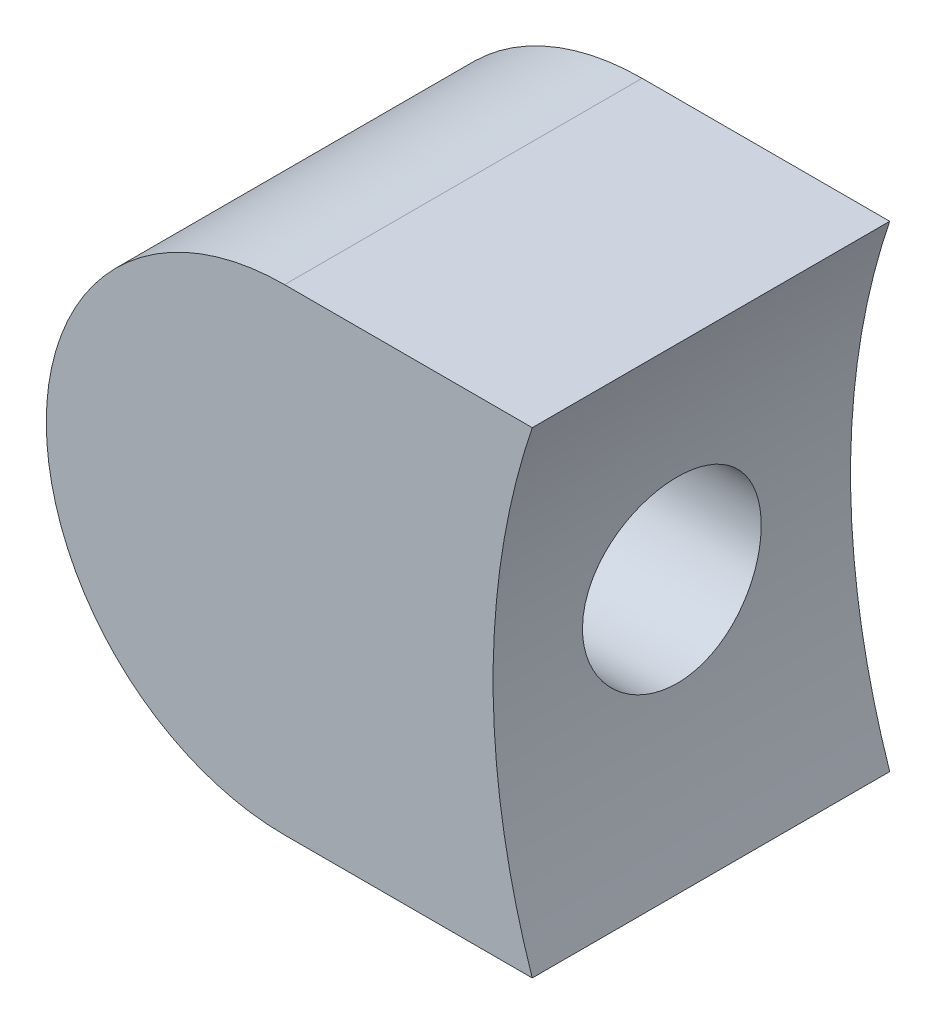
ISO-10303-21;
HEADER;
FILE_DESCRIPTION(('STEP AP214'),'2;1');
FILE_NAME('part.step','',(''),(''),'','','');
FILE_SCHEMA(('AUTOMOTIVE_DESIGN { 1 0 10303 214 1 1 1 1 }'));
ENDSEC;
DATA;
#1=APPLICATION_CONTEXT('core data for automotive mechanical design processes');
#2=APPLICATION_PROTOCOL_DEFINITION('international standard','automotive_design',2000,#1);
#3=PRODUCT_CONTEXT('',#1,'mechanical');
#4=PRODUCT('Part','Part','',(#3));
#5=PRODUCT_RELATED_PRODUCT_CATEGORY('part','',(#4));
#6=PRODUCT_DEFINITION_FORMATION('','',#4);
#7=PRODUCT_DEFINITION_CONTEXT('part definition',#1,'design');
#8=PRODUCT_DEFINITION('design','',#6,#7);
#9=PRODUCT_DEFINITION_SHAPE('','',#8);
#10=(LENGTH_UNIT() NAMED_UNIT(*) SI_UNIT(.MILLI.,.METRE.));
#11=(NAMED_UNIT(*) PLANE_ANGLE_UNIT() SI_UNIT($,.RADIAN.));
#12=(NAMED_UNIT(*) SI_UNIT($,.STERADIAN.) SOLID_ANGLE_UNIT());
#13=UNCERTAINTY_MEASURE_WITH_UNIT(LENGTH_MEASURE(1.E-05),#10,'distance_accuracy_value','');
#14=(GEOMETRIC_REPRESENTATION_CONTEXT(3) GLOBAL_UNCERTAINTY_ASSIGNED_CONTEXT((#13)) GLOBAL_UNIT_ASSIGNED_CONTEXT((#10,
#11,#12)) REPRESENTATION_CONTEXT('',''));
#15=CARTESIAN_POINT('',(0.,0.,0.));
#16=DIRECTION('',(0.,0.,1.));
#17=DIRECTION('',(1.,0.,0.));
#18=AXIS2_PLACEMENT_3D('',#15,#16,#17);
#19=CARTESIAN_POINT('',(0.,0.,6.));
#20=DIRECTION('',(0.,0.,-1.));
#21=DIRECTION('',(-1.,0.,0.));
#22=AXIS2_PLACEMENT_3D('',#19,#20,#21);
#23=CYLINDRICAL_SURFACE('',#22,12.5);
#24=CARTESIAN_POINT('',(-12.5,0.,4.5));
#25=CARTESIAN_POINT('',(-12.499998867873,0.0839320235538497,4.49999641802928));
#26=CARTESIAN_POINT('',(-12.4991457100204,0.167917158665596,4.49293167065366));
#27=CARTESIAN_POINT('',(-12.495824352711,0.333552285654125,4.46485946792231));
#28=CARTESIAN_POINT('',(-12.4933544466864,0.415199714795034,4.44383727937471));
#29=CARTESIAN_POINT('',(-12.4870779632713,0.573737397670264,4.38847686173699));
#30=CARTESIAN_POINT('',(-12.4832722657654,0.650630743796123,4.35414739658791));
#31=CARTESIAN_POINT('',(-12.4747479632173,0.797549578916,4.27316563245835));
#32=CARTESIAN_POINT('',(-12.4700295202071,0.867576283567578,4.22651552012334));
#33=CARTESIAN_POINT('',(-12.460180052721,0.999145657672255,4.12196256901238));
#34=CARTESIAN_POINT('',(-12.4550472515452,1.0606483456536,4.06400957994404));
#35=CARTESIAN_POINT('',(-12.4449619698576,1.17307965519171,3.93860351755605));
#36=CARTESIAN_POINT('',(-12.4400094983534,1.22400774913237,3.87114997049068));
#37=CARTESIAN_POINT('',(-12.4308280185202,1.31399171436948,3.72839958735081));
#38=CARTESIAN_POINT('',(-12.4266012951985,1.35301037836285,3.65307913770993));
#39=CARTESIAN_POINT('',(-12.4193730672343,1.4178302865078,3.49689564894563));
#40=CARTESIAN_POINT('',(-12.4163715196899,1.44363199348388,3.41603280401535));
#41=CARTESIAN_POINT('',(-12.4119503036869,1.481164650227,3.25147357034429));
#42=CARTESIAN_POINT('',(-12.4105230726271,1.49296288993823,3.16779273578616));
#43=CARTESIAN_POINT('',(-12.4093888845306,1.50236187609835,2.99962753181792));
#44=CARTESIAN_POINT('',(-12.4096818635516,1.49996315026424,2.91514319239152));
#45=CARTESIAN_POINT('',(-12.4119480733153,1.48109158039334,2.74823701760783));
#46=CARTESIAN_POINT('',(-12.4139124717338,1.46469271611151,2.66580668065991));
#47=CARTESIAN_POINT('',(-12.4192864043804,1.41840173085033,2.50487648608932));
#48=CARTESIAN_POINT('',(-12.4226959657844,1.38850935612907,2.4263767024105));
#49=CARTESIAN_POINT('',(-12.4305861039738,1.31599990349931,2.27530526588044));
#50=CARTESIAN_POINT('',(-12.4350693931099,1.27335053101962,2.20274926082322));
#51=CARTESIAN_POINT('',(-12.444599699395,1.17656086584735,2.06579639454212));
#52=CARTESIAN_POINT('',(-12.4496467403106,1.12242008861578,2.00139987754871));
#53=CARTESIAN_POINT('',(-12.4597751654319,1.0037737778109,1.88216445781781));
#54=CARTESIAN_POINT('',(-12.464856563712,0.939204450256078,1.82738901507147));
#55=CARTESIAN_POINT('',(-12.4744510399275,0.80175397946936,1.72944423949985));
#56=CARTESIAN_POINT('',(-12.478964116721,0.728872819540023,1.68627492999043));
#57=CARTESIAN_POINT('',(-12.4869159430851,0.576819654131422,1.61276835718017));
#58=CARTESIAN_POINT('',(-12.4903543736405,0.497645789357795,1.58243490333478));
#59=CARTESIAN_POINT('',(-12.4957665326545,0.33527801113672,1.53551063107455));
#60=CARTESIAN_POINT('',(-12.4977403242792,0.252084271220811,1.51891921999776));
#61=CARTESIAN_POINT('',(-12.4999926250152,0.0845871981871086,1.50003187225116));
#62=CARTESIAN_POINT('',(-12.5002815046876,0.000293860216026169,1.49764848379965));
#63=CARTESIAN_POINT('',(-12.4991593911616,-0.16749103412163,1.50701428893413));
#64=CARTESIAN_POINT('',(-12.4977484312654,-0.250982606163664,1.51876320564768));
#65=CARTESIAN_POINT('',(-12.4933916690343,-0.414537131964178,1.55598748200155));
#66=CARTESIAN_POINT('',(-12.4904505118954,-0.494609673184517,1.58142130652504));
#67=CARTESIAN_POINT('',(-12.4833627750896,-0.64935269884323,1.64525035167679));
#68=CARTESIAN_POINT('',(-12.4792161574379,-0.724023012961737,1.68364598074504));
#69=CARTESIAN_POINT('',(-12.4701542579347,-0.866233588832522,1.77252145795122));
#70=CARTESIAN_POINT('',(-12.4652354042322,-0.933738144813755,1.82305806890541));
#71=CARTESIAN_POINT('',(-12.455190895971,-1.05933812576102,1.93470042320409));
#72=CARTESIAN_POINT('',(-12.4500652338742,-1.11743320736475,1.99580655207398));
#73=CARTESIAN_POINT('',(-12.4401529742471,-1.22287397613077,2.12723780771384));
#74=CARTESIAN_POINT('',(-12.4353682915654,-1.27016181615969,2.19760950767193));
#75=CARTESIAN_POINT('',(-12.4267107496692,-1.35224657214666,2.34534751253778));
#76=CARTESIAN_POINT('',(-12.4228378733971,-1.38704372178037,2.42271368655912));
#77=CARTESIAN_POINT('',(-12.4164552867251,-1.44306498334079,2.58205530444735));
#78=CARTESIAN_POINT('',(-12.4139422637816,-1.46432210079673,2.6640190059297));
#79=CARTESIAN_POINT('',(-12.4105542637293,-1.49276636081758,2.83038448474253));
#80=CARTESIAN_POINT('',(-12.4096792168553,-1.49995410263041,2.91478615807866));
#81=CARTESIAN_POINT('',(-12.4096681633035,-1.50004516908965,3.08305636481859));
#82=CARTESIAN_POINT('',(-12.4105210931972,-1.49303936835675,3.16692486288563));
#83=CARTESIAN_POINT('',(-12.4138461473713,-1.46513424336044,3.33228339319708));
#84=CARTESIAN_POINT('',(-12.4163182722328,-1.44423491411034,3.41377342458779));
#85=CARTESIAN_POINT('',(-12.4225998262293,-1.38916369910273,3.57205226944435));
#86=CARTESIAN_POINT('',(-12.4264088508406,-1.35499582785269,3.64884249674774));
#87=CARTESIAN_POINT('',(-12.4349357269569,-1.27436641314005,3.79561387353505));
#88=CARTESIAN_POINT('',(-12.4396535863076,-1.22790476354723,3.86559496422965));
#89=CARTESIAN_POINT('',(-12.4495027561294,-1.12366844823603,3.99722647005442));
#90=CARTESIAN_POINT('',(-12.4546364290673,-1.06582601965075,4.05882305163314));
#91=CARTESIAN_POINT('',(-12.4647177484085,-0.940610466672236,4.171471239783));
#92=CARTESIAN_POINT('',(-12.4696653505255,-0.873235091318004,4.2225203488146));
#93=CARTESIAN_POINT('',(-12.4788360854662,-0.730596612325683,4.31277528899943));
#94=CARTESIAN_POINT('',(-12.4830566108105,-0.655306617312087,4.35193886286114));
#95=CARTESIAN_POINT('',(-12.4902709259863,-0.499211375842655,4.41701188222129));
#96=CARTESIAN_POINT('',(-12.4932660590307,-0.418412282181072,4.44293584809019));
#97=CARTESIAN_POINT('',(-12.4969634163,-0.280988550618348,4.47453171016906));
#98=CARTESIAN_POINT('',(-12.4980966397165,-0.225233284876743,4.48406874194319));
#99=CARTESIAN_POINT('',(-12.4996153102102,-0.112993367846847,4.49680407174548));
#100=CARTESIAN_POINT('',(-12.5000007622246,-0.0565087213768126,4.50000241162523));
#101=CARTESIAN_POINT('',(-12.5,0.,4.5));
#102=B_SPLINE_CURVE_WITH_KNOTS('',3,(#24,#25,#26,#27,#28,#29,#30,#31,#32,#33,#34,#35,#36,#37,
#38,#39,#40,#41,#42,#43,#44,#45,#46,#47,#48,#49,#50,#51,#52,#53,#54,#55,#56,#57,#58,#59,#60,#61,
#62,#63,#64,#65,#66,#67,#68,#69,#70,#71,#72,#73,#74,#75,#76,#77,#78,#79,#80,#81,#82,#83,#84,#85,
#86,#87,#88,#89,#90,#91,#92,#93,#94,#95,#96,#97,#98,#99,#100,#101),.UNSPECIFIED.,.T.,.F.,(4,2,2,
2,2,2,2,2,2,2,2,2,2,2,2,2,2,2,2,2,2,2,2,2,2,2,2,2,2,2,2,2,2,2,2,2,2,2,4),(0.,0.25158967547808,
0.503445347043117,0.7551354318778,1.00678087720846,1.25956936097939,1.51237045452442,
1.76595344748199,2.01952755999557,2.27187819171639,2.5242194433424,2.77523546456126,
3.02625620626698,3.27791786855268,3.52959014434631,3.78286472320158,4.036139810863,
4.28949001347139,4.54282928911309,4.79460761312113,5.04638100450539,5.29739451278874,
5.54841593150834,5.80063460892781,6.05286248801782,6.30641037908358,6.55995352653149,
6.81287624132444,7.06578818330771,7.31708596596146,7.56838383881168,7.81960573856942,
8.07082980715607,8.32359762010159,8.57642521760045,8.83014145119729,9.08357882396374,
9.25296714728133,9.42235435219904),.UNSPECIFIED.);
#103=CARTESIAN_POINT('',(-12.5,0.,4.5));
#104=VERTEX_POINT('',#103);
#105=EDGE_CURVE('E146',#104,#104,#102,.T.);
#106=ORIENTED_EDGE('',*,*,#105,.T.);
#107=EDGE_LOOP('',(#106));
#108=FACE_BOUND('',#107,.T.);
#109=CARTESIAN_POINT('',(0.,0.,0.));
#110=DIRECTION('',(0.,0.,-1.));
#111=DIRECTION('',(1.,0.,0.));
#112=AXIS2_PLACEMENT_3D('',#109,#110,#111);
#113=CIRCLE('',#112,12.5);
#114=CARTESIAN_POINT('',(-11.842719282327,-4.,0.));
#115=VERTEX_POINT('',#114);
#116=CARTESIAN_POINT('',(-11.842719282327,4.,0.));
#117=VERTEX_POINT('',#116);
#118=EDGE_CURVE('E114',#115,#117,#113,.T.);
#119=ORIENTED_EDGE('',*,*,#118,.T.);
#120=DIRECTION('',(0.,0.,-1.));
#121=VECTOR('',#120,1.);
#122=CARTESIAN_POINT('',(-11.842719282327,4.,6.));
#123=LINE('',#122,#121);
#124=CARTESIAN_POINT('',(-11.842719282327,4.,6.));
#125=VERTEX_POINT('',#124);
#126=EDGE_CURVE('E97',#125,#117,#123,.T.);
#127=ORIENTED_EDGE('',*,*,#126,.F.);
#128=CARTESIAN_POINT('',(0.,0.,6.));
#129=DIRECTION('',(0.,0.,-1.));
#130=DIRECTION('',(1.,0.,0.));
#131=AXIS2_PLACEMENT_3D('',#128,#129,#130);
#132=CIRCLE('',#131,12.5);
#133=CARTESIAN_POINT('',(-11.842719282327,-4.,6.));
#134=VERTEX_POINT('',#133);
#135=EDGE_CURVE('E103',#134,#125,#132,.T.);
#136=ORIENTED_EDGE('',*,*,#135,.F.);
#137=DIRECTION('',(0.,0.,-1.));
#138=VECTOR('',#137,1.);
#139=CARTESIAN_POINT('',(-11.842719282327,-4.,6.));
#140=LINE('',#139,#138);
#141=EDGE_CURVE('E117',#134,#115,#140,.T.);
#142=ORIENTED_EDGE('',*,*,#141,.T.);
#143=EDGE_LOOP('',(#119,#127,#136,#142));
#144=FACE_BOUND('',#143,.T.);
#145=ADVANCED_FACE('F39',(#108,#144),#23,.F.);
#146=CARTESIAN_POINT('',(-11.842719282327,4.,6.));
#147=DIRECTION('',(0.,-1.,0.));
#148=DIRECTION('',(0.,0.,-1.));
#149=AXIS2_PLACEMENT_3D('',#146,#147,#148);
#150=PLANE('',#149);
#151=DIRECTION('',(-1.,0.,0.));
#152=VECTOR('',#151,1.);
#153=CARTESIAN_POINT('',(-11.842719282327,4.,0.));
#154=LINE('',#153,#152);
#155=CARTESIAN_POINT('',(-16.,4.,0.));
#156=VERTEX_POINT('',#155);
#157=EDGE_CURVE('E182',#117,#156,#154,.T.);
#158=ORIENTED_EDGE('',*,*,#157,.T.);
#159=DIRECTION('',(0.,0.,-1.));
#160=VECTOR('',#159,1.);
#161=CARTESIAN_POINT('',(-16.,4.,6.));
#162=LINE('',#161,#160);
#163=CARTESIAN_POINT('',(-16.,4.,6.));
#164=VERTEX_POINT('',#163);
#165=EDGE_CURVE('E100',#156,#164,#162,.F.);
#166=ORIENTED_EDGE('',*,*,#165,.T.);
#167=DIRECTION('',(-1.,0.,0.));
#168=VECTOR('',#167,1.);
#169=CARTESIAN_POINT('',(-11.842719282327,4.,6.));
#170=LINE('',#169,#168);
#171=EDGE_CURVE('E92',#125,#164,#170,.T.);
#172=ORIENTED_EDGE('',*,*,#171,.F.);
#173=ORIENTED_EDGE('',*,*,#126,.T.);
#174=EDGE_LOOP('',(#158,#166,#172,#173));
#175=FACE_BOUND('',#174,.T.);
#176=ADVANCED_FACE('F95',(#175),#150,.F.);
#177=CARTESIAN_POINT('',(-20.,-4.,6.));
#178=DIRECTION('',(0.,1.,0.));
#179=DIRECTION('',(0.,0.,1.));
#180=AXIS2_PLACEMENT_3D('',#177,#178,#179);
#181=PLANE('',#180);
#182=DIRECTION('',(1.,0.,0.));
#183=VECTOR('',#182,1.);
#184=CARTESIAN_POINT('',(-20.,-4.,6.));
#185=LINE('',#184,#183);
#186=CARTESIAN_POINT('',(-16.,-4.,6.));
#187=VERTEX_POINT('',#186);
#188=EDGE_CURVE('E102',#187,#134,#185,.T.);
#189=ORIENTED_EDGE('',*,*,#188,.F.);
#190=DIRECTION('',(0.,0.,-1.));
#191=VECTOR('',#190,1.);
#192=CARTESIAN_POINT('',(-16.,-4.,6.));
#193=LINE('',#192,#191);
#194=CARTESIAN_POINT('',(-16.,-4.,0.));
#195=VERTEX_POINT('',#194);
#196=EDGE_CURVE('E11',#187,#195,#193,.T.);
#197=ORIENTED_EDGE('',*,*,#196,.T.);
#198=DIRECTION('',(1.,0.,0.));
#199=VECTOR('',#198,1.);
#200=CARTESIAN_POINT('',(-20.,-4.,0.));
#201=LINE('',#200,#199);
#202=EDGE_CURVE('E111',#195,#115,#201,.T.);
#203=ORIENTED_EDGE('',*,*,#202,.T.);
#204=ORIENTED_EDGE('',*,*,#141,.F.);
#205=EDGE_LOOP('',(#189,#197,#203,#204));
#206=FACE_BOUND('',#205,.T.);
#207=ADVANCED_FACE('F190',(#206),#181,.F.);
#208=CARTESIAN_POINT('',(0.,0.,6.));
#209=DIRECTION('',(0.,0.,1.));
#210=DIRECTION('',(1.,0.,0.));
#211=AXIS2_PLACEMENT_3D('',#208,#209,#210);
#212=PLANE('',#211);
#213=ORIENTED_EDGE('',*,*,#171,.T.);
#214=CARTESIAN_POINT('',(-16.,0.,6.));
#215=DIRECTION('',(0.,0.,1.));
#216=DIRECTION('',(1.,0.,0.));
#217=AXIS2_PLACEMENT_3D('',#214,#215,#216);
#218=CIRCLE('',#217,4.);
#219=CARTESIAN_POINT('',(-20.,0.,6.));
#220=VERTEX_POINT('',#219);
#221=EDGE_CURVE('E50',#164,#220,#218,.T.);
#222=ORIENTED_EDGE('',*,*,#221,.T.);
#223=CARTESIAN_POINT('',(-16.,0.,6.));
#224=DIRECTION('',(0.,0.,1.));
#225=DIRECTION('',(1.,0.,0.));
#226=AXIS2_PLACEMENT_3D('',#223,#224,#225);
#227=CIRCLE('',#226,4.);
#228=EDGE_CURVE('E58',#220,#187,#227,.T.);
#229=ORIENTED_EDGE('',*,*,#228,.T.);
#230=ORIENTED_EDGE('',*,*,#188,.T.);
#231=ORIENTED_EDGE('',*,*,#135,.T.);
#232=EDGE_LOOP('',(#213,#222,#229,#230,#231));
#233=FACE_BOUND('',#232,.T.);
#234=ADVANCED_FACE('F106',(#233),#212,.T.);
#235=CARTESIAN_POINT('',(0.,0.,0.));
#236=DIRECTION('',(0.,0.,1.));
#237=DIRECTION('',(1.,0.,0.));
#238=AXIS2_PLACEMENT_3D('',#235,#236,#237);
#239=PLANE('',#238);
#240=CARTESIAN_POINT('',(-16.,0.,0.));
#241=DIRECTION('',(0.,0.,1.));
#242=DIRECTION('',(1.,0.,0.));
#243=AXIS2_PLACEMENT_3D('',#240,#241,#242);
#244=CIRCLE('',#243,4.);
#245=CARTESIAN_POINT('',(-20.,0.,0.));
#246=VERTEX_POINT('',#245);
#247=EDGE_CURVE('E195',#195,#246,#244,.F.);
#248=ORIENTED_EDGE('',*,*,#247,.T.);
#249=CARTESIAN_POINT('',(-16.,0.,0.));
#250=DIRECTION('',(0.,0.,1.));
#251=DIRECTION('',(1.,0.,0.));
#252=AXIS2_PLACEMENT_3D('',#249,#250,#251);
#253=CIRCLE('',#252,4.);
#254=EDGE_CURVE('E194',#246,#156,#253,.F.);
#255=ORIENTED_EDGE('',*,*,#254,.T.);
#256=ORIENTED_EDGE('',*,*,#157,.F.);
#257=ORIENTED_EDGE('',*,*,#118,.F.);
#258=ORIENTED_EDGE('',*,*,#202,.F.);
#259=EDGE_LOOP('',(#248,#255,#256,#257,#258));
#260=FACE_BOUND('',#259,.T.);
#261=ADVANCED_FACE('F140',(#260),#239,.F.);
#262=CARTESIAN_POINT('',(-10.,0.,3.));
#263=DIRECTION('',(-1.,0.,0.));
#264=DIRECTION('',(0.,0.,1.));
#265=AXIS2_PLACEMENT_3D('',#262,#263,#264);
#266=CYLINDRICAL_SURFACE('',#265,1.5);
#267=CARTESIAN_POINT('',(-20.,0.,1.5));
#268=CARTESIAN_POINT('',(-20.0000033256289,-0.0406944283973191,1.49999877177197));
#269=CARTESIAN_POINT('',(-19.9993782607743,-0.0813680861182127,1.50165712503439));
#270=CARTESIAN_POINT('',(-19.9969069712268,-0.162399201823214,1.50826302501836));
#271=CARTESIAN_POINT('',(-19.9950610770269,-0.202756742392983,1.51320968155921));
#272=CARTESIAN_POINT('',(-19.9877647102678,-0.322653174897333,1.53288546719824));
#273=CARTESIAN_POINT('',(-19.9805549700143,-0.401348400681007,1.55245098462581));
#274=CARTESIAN_POINT('',(-19.9621900045024,-0.554058449818505,1.60374913887558));
#275=CARTESIAN_POINT('',(-19.9510369944509,-0.628075873554347,1.63547494526381));
#276=CARTESIAN_POINT('',(-19.9258928809211,-0.769770959011273,1.71009023032854));
#277=CARTESIAN_POINT('',(-19.9118999676605,-0.837444537591144,1.75298683276697));
#278=CARTESIAN_POINT('',(-19.8818626368544,-0.967346599491284,1.85061205264806));
#279=CARTESIAN_POINT('',(-19.8657603874358,-1.02926958467277,1.90572904267475));
#280=CARTESIAN_POINT('',(-19.8336025717856,-1.14324279320908,2.02540895864939));
#281=CARTESIAN_POINT('',(-19.8175470225959,-1.19528977206722,2.0899749765254));
#282=CARTESIAN_POINT('',(-19.7866244159186,-1.28998298069114,2.22971878513964));
#283=CARTESIAN_POINT('',(-19.7718259434661,-1.33219550604264,2.30520715291591));
#284=CARTESIAN_POINT('',(-19.7459981946454,-1.40318750743587,2.46285138088627));
#285=CARTESIAN_POINT('',(-19.7349672753239,-1.43197284081049,2.54500431540721));
#286=CARTESIAN_POINT('',(-19.7185442072057,-1.47408411229866,2.71011594674405));
#287=CARTESIAN_POINT('',(-19.7129393523968,-1.48799566181386,2.7929034135809));
#288=CARTESIAN_POINT('',(-19.7073806149005,-1.50179556476095,2.95981450775102));
#289=CARTESIAN_POINT('',(-19.707424508727,-1.50168943589491,3.04393759631328));
#290=CARTESIAN_POINT('',(-19.7129751352208,-1.4879042504185,3.20577008106313));
#291=CARTESIAN_POINT('',(-19.7181547625154,-1.47503790683102,3.28356200778895));
#292=CARTESIAN_POINT('',(-19.7328495149351,-1.43744132424502,3.4357882053831));
#293=CARTESIAN_POINT('',(-19.742365231753,-1.41270946608174,3.51022201648687));
#294=CARTESIAN_POINT('',(-19.7648570030481,-1.35163755391211,3.65527694419289));
#295=CARTESIAN_POINT('',(-19.7778951363466,-1.3150866725211,3.72579924658127));
#296=CARTESIAN_POINT('',(-19.8059420521327,-1.2315608289882,3.85994553304031));
#297=CARTESIAN_POINT('',(-19.8209515207572,-1.18458223346155,3.92356710112008));
#298=CARTESIAN_POINT('',(-19.852479297884,-1.07782175128324,4.04659938969123));
#299=CARTESIAN_POINT('',(-19.869031253415,-1.01739205795079,4.10544067477581));
#300=CARTESIAN_POINT('',(-19.9009152212378,-0.887320986512529,4.21233157847093));
#301=CARTESIAN_POINT('',(-19.916246881528,-0.817676965789148,4.26037809049486));
#302=CARTESIAN_POINT('',(-19.9442714882872,-0.66968723986154,4.34495289658393));
#303=CARTESIAN_POINT('',(-19.9569184850499,-0.591220539542261,4.38128541127984));
#304=CARTESIAN_POINT('',(-19.9777960785474,-0.428732848852288,4.44000775973094));
#305=CARTESIAN_POINT('',(-19.9860333225548,-0.344720434087237,4.46241858729892));
#306=CARTESIAN_POINT('',(-19.9943652641226,-0.216558436440288,4.48492299165084));
#307=CARTESIAN_POINT('',(-19.9964719936983,-0.173445649042698,4.49057254696174));
#308=CARTESIAN_POINT('',(-19.9992907488365,-0.0868967349374135,4.49810974589236));
#309=CARTESIAN_POINT('',(-20.0000043474261,-0.0434610285634967,4.50000163245323));
#310=CARTESIAN_POINT('',(-20.,0.,4.5));
#311=B_SPLINE_CURVE_WITH_KNOTS('',3,(#267,#268,#269,#270,#271,#272,#273,#274,#275,#276,#277,
#278,#279,#280,#281,#282,#283,#284,#285,#286,#287,#288,#289,#290,#291,#292,#293,#294,#295,#296,
#297,#298,#299,#300,#301,#302,#303,#304,#305,#306,#307,#308,#309,#310),.UNSPECIFIED.,.F.,.F.,(4,
2,2,2,2,2,2,2,2,2,2,2,2,2,2,2,2,2,2,2,2,4),(0.,0.122004165629939,0.243975316802218,
0.486933389122464,0.729755191418078,0.972732225167151,1.22496219975096,1.47727489479742,
1.7392004007286,2.00101154001053,2.25208513778236,2.50305990712181,2.73901396321912,
2.97500022670228,3.21545253315063,3.45598875358111,3.7126732008052,3.96943142391607,
4.23028180536024,4.49073786512117,4.62117204894323,4.75145887014864),.UNSPECIFIED.);
#312=CARTESIAN_POINT('',(-20.,0.,1.5));
#313=VERTEX_POINT('',#312);
#314=CARTESIAN_POINT('',(-20.,0.,4.5));
#315=VERTEX_POINT('',#314);
#316=EDGE_CURVE('E116',#313,#315,#311,.T.);
#317=ORIENTED_EDGE('',*,*,#316,.T.);
#318=CARTESIAN_POINT('',(-20.,0.,4.5));
#319=CARTESIAN_POINT('',(-20.0000033256289,0.040694428397319,4.50000122822803));
#320=CARTESIAN_POINT('',(-19.9993782607743,0.0813680861182128,4.49834287496561));
#321=CARTESIAN_POINT('',(-19.9969069712268,0.162399201823214,4.49173697498164));
#322=CARTESIAN_POINT('',(-19.9950610770269,0.202756742392983,4.48679031844079));
#323=CARTESIAN_POINT('',(-19.9877647102678,0.322653174897333,4.46711453280176));
#324=CARTESIAN_POINT('',(-19.9805549700143,0.401348400681007,4.44754901537419));
#325=CARTESIAN_POINT('',(-19.9621900045024,0.554058449818504,4.39625086112442));
#326=CARTESIAN_POINT('',(-19.9510369944509,0.628075873554347,4.36452505473619));
#327=CARTESIAN_POINT('',(-19.9258928809211,0.769770959011272,4.28990976967146));
#328=CARTESIAN_POINT('',(-19.9118999676605,0.837444537591144,4.24701316723303));
#329=CARTESIAN_POINT('',(-19.8818626368544,0.967346599491283,4.14938794735194));
#330=CARTESIAN_POINT('',(-19.8657603874358,1.02926958467277,4.09427095732525));
#331=CARTESIAN_POINT('',(-19.8336025717856,1.14324279320908,3.97459104135061));
#332=CARTESIAN_POINT('',(-19.8175470225959,1.19528977206722,3.9100250234746));
#333=CARTESIAN_POINT('',(-19.7866244159186,1.28998298069114,3.77028121486036));
#334=CARTESIAN_POINT('',(-19.7718259434661,1.33219550604264,3.69479284708409));
#335=CARTESIAN_POINT('',(-19.7459981946454,1.40318750743587,3.53714861911373));
#336=CARTESIAN_POINT('',(-19.7349672753239,1.43197284081049,3.45499568459279));
#337=CARTESIAN_POINT('',(-19.7185442072057,1.47408411229866,3.28988405325595));
#338=CARTESIAN_POINT('',(-19.7129393523968,1.48799566181386,3.2070965864191));
#339=CARTESIAN_POINT('',(-19.7073806149005,1.50179556476095,3.04018549224898));
#340=CARTESIAN_POINT('',(-19.707424508727,1.50168943589491,2.95606240368672));
#341=CARTESIAN_POINT('',(-19.7129751352208,1.4879042504185,2.79422991893687));
#342=CARTESIAN_POINT('',(-19.7181547625154,1.47503790683102,2.71643799221105));
#343=CARTESIAN_POINT('',(-19.7328495149351,1.43744132424502,2.5642117946169));
#344=CARTESIAN_POINT('',(-19.742365231753,1.41270946608174,2.48977798351313));
#345=CARTESIAN_POINT('',(-19.7648570030481,1.35163755391211,2.34472305580711));
#346=CARTESIAN_POINT('',(-19.7778951363466,1.3150866725211,2.27420075341873));
#347=CARTESIAN_POINT('',(-19.8059420521327,1.2315608289882,2.14005446695969));
#348=CARTESIAN_POINT('',(-19.8209515207572,1.18458223346155,2.07643289887992));
#349=CARTESIAN_POINT('',(-19.852479297884,1.07782175128324,1.95340061030877));
#350=CARTESIAN_POINT('',(-19.869031253415,1.01739205795079,1.89455932522419));
#351=CARTESIAN_POINT('',(-19.9009152212378,0.88732098651253,1.78766842152907));
#352=CARTESIAN_POINT('',(-19.916246881528,0.817676965789149,1.73962190950514));
#353=CARTESIAN_POINT('',(-19.9442714882872,0.669687239861542,1.65504710341607));
#354=CARTESIAN_POINT('',(-19.9569184850499,0.591220539542263,1.61871458872017));
#355=CARTESIAN_POINT('',(-19.9777960785474,0.42873284885229,1.55999224026906));
#356=CARTESIAN_POINT('',(-19.9860333225548,0.344720434087239,1.53758141270108));
#357=CARTESIAN_POINT('',(-19.9943652641226,0.216558436440289,1.51507700834916));
#358=CARTESIAN_POINT('',(-19.9964719936983,0.173445649042699,1.50942745303826));
#359=CARTESIAN_POINT('',(-19.9992907488365,0.0868967349374139,1.50189025410764));
#360=CARTESIAN_POINT('',(-20.0000043474261,0.0434610285634971,1.49999836754677));
#361=CARTESIAN_POINT('',(-20.,0.,1.5));
#362=B_SPLINE_CURVE_WITH_KNOTS('',3,(#318,#319,#320,#321,#322,#323,#324,#325,#326,#327,#328,
#329,#330,#331,#332,#333,#334,#335,#336,#337,#338,#339,#340,#341,#342,#343,#344,#345,#346,#347,
#348,#349,#350,#351,#352,#353,#354,#355,#356,#357,#358,#359,#360,#361),.UNSPECIFIED.,.F.,.F.,(4,
2,2,2,2,2,2,2,2,2,2,2,2,2,2,2,2,2,2,2,2,4),(0.,0.122004165629939,0.243975316802218,
0.486933389122464,0.729755191418078,0.97273222516715,1.22496219975096,1.47727489479742,
1.7392004007286,2.00101154001053,2.25208513778236,2.50305990712181,2.73901396321912,
2.97500022670228,3.21545253315063,3.45598875358111,3.7126732008052,3.96943142391607,
4.23028180536024,4.49073786512118,4.62117204894323,4.75145887014865),.UNSPECIFIED.);
#363=EDGE_CURVE('E121',#315,#313,#362,.T.);
#364=ORIENTED_EDGE('',*,*,#363,.T.);
#365=EDGE_LOOP('',(#317,#364));
#366=FACE_BOUND('',#365,.T.);
#367=ORIENTED_EDGE('',*,*,#105,.F.);
#368=EDGE_LOOP('',(#367));
#369=FACE_BOUND('',#368,.T.);
#370=ADVANCED_FACE('F136',(#366,#369),#266,.F.);
#371=CARTESIAN_POINT('',(-16.,0.,6.));
#372=DIRECTION('',(0.,0.,-1.));
#373=DIRECTION('',(-1.,0.,0.));
#374=AXIS2_PLACEMENT_3D('',#371,#372,#373);
#375=CYLINDRICAL_SURFACE('',#374,4.);
#376=ORIENTED_EDGE('',*,*,#196,.F.);
#377=ORIENTED_EDGE('',*,*,#228,.F.);
#378=DIRECTION('',(0.,0.,-1.));
#379=VECTOR('',#378,1.);
#380=CARTESIAN_POINT('',(-20.,0.,6.));
#381=LINE('',#380,#379);
#382=EDGE_CURVE('E44',#315,#220,#381,.F.);
#383=ORIENTED_EDGE('',*,*,#382,.F.);
#384=ORIENTED_EDGE('',*,*,#316,.F.);
#385=DIRECTION('',(0.,0.,-1.));
#386=VECTOR('',#385,1.);
#387=CARTESIAN_POINT('',(-20.,0.,6.));
#388=LINE('',#387,#386);
#389=EDGE_CURVE('E175',#246,#313,#388,.F.);
#390=ORIENTED_EDGE('',*,*,#389,.F.);
#391=ORIENTED_EDGE('',*,*,#247,.F.);
#392=EDGE_LOOP('',(#376,#377,#383,#384,#390,#391));
#393=FACE_BOUND('',#392,.T.);
#394=ADVANCED_FACE('F41',(#393),#375,.T.);
#395=CARTESIAN_POINT('',(-16.,0.,6.));
#396=DIRECTION('',(0.,0.,-1.));
#397=DIRECTION('',(-1.,0.,0.));
#398=AXIS2_PLACEMENT_3D('',#395,#396,#397);
#399=CYLINDRICAL_SURFACE('',#398,4.);
#400=ORIENTED_EDGE('',*,*,#221,.F.);
#401=ORIENTED_EDGE('',*,*,#165,.F.);
#402=ORIENTED_EDGE('',*,*,#254,.F.);
#403=ORIENTED_EDGE('',*,*,#389,.T.);
#404=ORIENTED_EDGE('',*,*,#363,.F.);
#405=ORIENTED_EDGE('',*,*,#382,.T.);
#406=EDGE_LOOP('',(#400,#401,#402,#403,#404,#405));
#407=FACE_BOUND('',#406,.T.);
#408=ADVANCED_FACE('F158',(#407),#399,.T.);
#409=CLOSED_SHELL('',(#145,#176,#207,#234,#261,#370,#394,#408));
#410=MANIFOLD_SOLID_BREP('B2',#409);
#411=ADVANCED_BREP_SHAPE_REPRESENTATION('',(#18,#410),#14);
#412=SHAPE_DEFINITION_REPRESENTATION(#9,#411);
ENDSEC;
END-ISO-10303-21;
